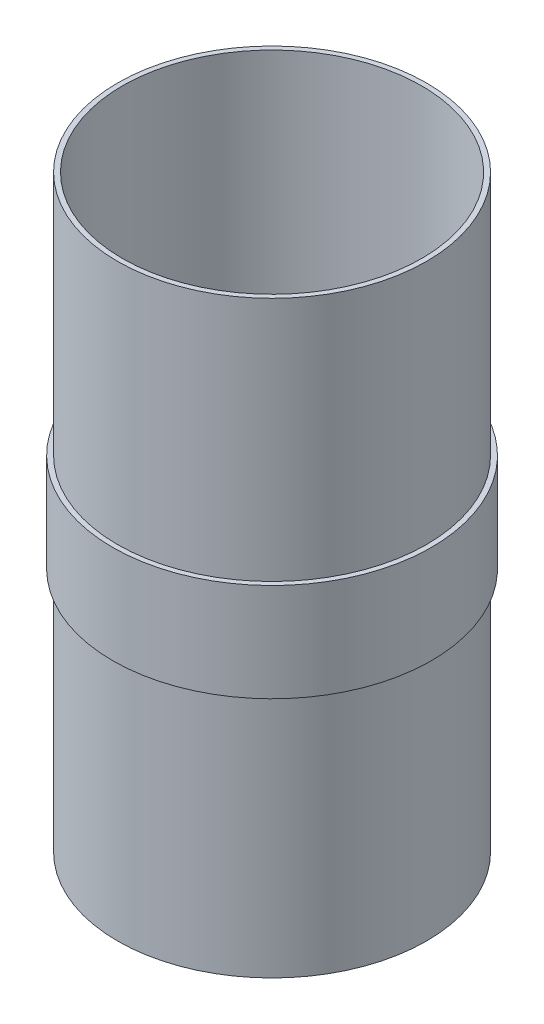
ISO-10303-21;
HEADER;
FILE_DESCRIPTION(('STEP AP214'),'2;1');
FILE_NAME('part.step','',(''),(''),'','','');
FILE_SCHEMA(('AUTOMOTIVE_DESIGN { 1 0 10303 214 1 1 1 1 }'));
ENDSEC;
DATA;
#1=APPLICATION_CONTEXT('core data for automotive mechanical design processes');
#2=APPLICATION_PROTOCOL_DEFINITION('international standard','automotive_design',2000,#1);
#3=PRODUCT_CONTEXT('',#1,'mechanical');
#4=PRODUCT('Part','Part','',(#3));
#5=PRODUCT_RELATED_PRODUCT_CATEGORY('part','',(#4));
#6=PRODUCT_DEFINITION_FORMATION('','',#4);
#7=PRODUCT_DEFINITION_CONTEXT('part definition',#1,'design');
#8=PRODUCT_DEFINITION('design','',#6,#7);
#9=PRODUCT_DEFINITION_SHAPE('','',#8);
#10=(LENGTH_UNIT() NAMED_UNIT(*) SI_UNIT(.MILLI.,.METRE.));
#11=(NAMED_UNIT(*) PLANE_ANGLE_UNIT() SI_UNIT($,.RADIAN.));
#12=(NAMED_UNIT(*) SI_UNIT($,.STERADIAN.) SOLID_ANGLE_UNIT());
#13=UNCERTAINTY_MEASURE_WITH_UNIT(LENGTH_MEASURE(1.E-05),#10,'distance_accuracy_value','');
#14=(GEOMETRIC_REPRESENTATION_CONTEXT(3) GLOBAL_UNCERTAINTY_ASSIGNED_CONTEXT((#13)) GLOBAL_UNIT_ASSIGNED_CONTEXT((#10,
#11,#12)) REPRESENTATION_CONTEXT('',''));
#15=CARTESIAN_POINT('',(0.,0.,0.));
#16=DIRECTION('',(0.,0.,1.));
#17=DIRECTION('',(1.,0.,0.));
#18=AXIS2_PLACEMENT_3D('',#15,#16,#17);
#19=CARTESIAN_POINT('',(0.,0.,0.));
#20=DIRECTION('',(0.,1.,0.));
#21=DIRECTION('',(0.,0.,1.));
#22=AXIS2_PLACEMENT_3D('',#19,#20,#21);
#23=PLANE('',#22);
#24=CARTESIAN_POINT('',(0.,0.,0.));
#25=DIRECTION('',(0.,1.,0.));
#26=DIRECTION('',(0.,0.,1.));
#27=AXIS2_PLACEMENT_3D('',#24,#25,#26);
#28=CIRCLE('',#27,31.5);
#29=CARTESIAN_POINT('',(0.,0.,31.5));
#30=VERTEX_POINT('',#29);
#31=EDGE_CURVE('E62',#30,#30,#28,.T.);
#32=ORIENTED_EDGE('',*,*,#31,.F.);
#33=EDGE_LOOP('',(#32));
#34=FACE_BOUND('',#33,.T.);
#35=CARTESIAN_POINT('',(0.,0.,0.));
#36=DIRECTION('',(0.,1.,0.));
#37=DIRECTION('',(0.,0.,1.));
#38=AXIS2_PLACEMENT_3D('',#35,#36,#37);
#39=CIRCLE('',#38,30.5);
#40=CARTESIAN_POINT('',(0.,0.,30.5));
#41=VERTEX_POINT('',#40);
#42=EDGE_CURVE('E71',#41,#41,#39,.T.);
#43=ORIENTED_EDGE('',*,*,#42,.T.);
#44=EDGE_LOOP('',(#43));
#45=FACE_BOUND('',#44,.T.);
#46=ADVANCED_FACE('F58',(#34,#45),#23,.F.);
#47=CARTESIAN_POINT('',(0.,50.,0.));
#48=DIRECTION('',(0.,-1.,0.));
#49=DIRECTION('',(0.,0.,-1.));
#50=AXIS2_PLACEMENT_3D('',#47,#48,#49);
#51=CYLINDRICAL_SURFACE('',#50,31.5);
#52=CARTESIAN_POINT('',(0.,50.,0.));
#53=DIRECTION('',(0.,1.,0.));
#54=DIRECTION('',(0.,0.,1.));
#55=AXIS2_PLACEMENT_3D('',#52,#53,#54);
#56=CIRCLE('',#55,31.5);
#57=CARTESIAN_POINT('',(0.,50.,31.5));
#58=VERTEX_POINT('',#57);
#59=EDGE_CURVE('E11',#58,#58,#56,.T.);
#60=ORIENTED_EDGE('',*,*,#59,.F.);
#61=EDGE_LOOP('',(#60));
#62=FACE_BOUND('',#61,.T.);
#63=ORIENTED_EDGE('',*,*,#31,.T.);
#64=EDGE_LOOP('',(#63));
#65=FACE_BOUND('',#64,.T.);
#66=ADVANCED_FACE('F60',(#62,#65),#51,.T.);
#67=CARTESIAN_POINT('',(0.,50.,0.));
#68=DIRECTION('',(0.,-1.,0.));
#69=DIRECTION('',(0.,0.,-1.));
#70=AXIS2_PLACEMENT_3D('',#67,#68,#69);
#71=CYLINDRICAL_SURFACE('',#70,30.5);
#72=ORIENTED_EDGE('',*,*,#42,.F.);
#73=EDGE_LOOP('',(#72));
#74=FACE_BOUND('',#73,.T.);
#75=CARTESIAN_POINT('',(0.,65.,0.));
#76=DIRECTION('',(0.,1.,0.));
#77=DIRECTION('',(0.,0.,1.));
#78=AXIS2_PLACEMENT_3D('',#75,#76,#77);
#79=CIRCLE('',#78,30.5);
#80=CARTESIAN_POINT('',(0.,65.,30.5));
#81=VERTEX_POINT('',#80);
#82=EDGE_CURVE('E85',#81,#81,#79,.T.);
#83=ORIENTED_EDGE('',*,*,#82,.T.);
#84=EDGE_LOOP('',(#83));
#85=FACE_BOUND('',#84,.T.);
#86=ADVANCED_FACE('F130',(#74,#85),#71,.F.);
#87=CARTESIAN_POINT('',(0.,70.,0.));
#88=DIRECTION('',(0.,1.,0.));
#89=DIRECTION('',(0.,0.,1.));
#90=AXIS2_PLACEMENT_3D('',#87,#88,#89);
#91=PLANE('',#90);
#92=CARTESIAN_POINT('',(0.,70.,0.));
#93=DIRECTION('',(0.,1.,0.));
#94=DIRECTION('',(0.,0.,1.));
#95=AXIS2_PLACEMENT_3D('',#92,#93,#94);
#96=CIRCLE('',#95,30.5);
#97=CARTESIAN_POINT('',(0.,70.,30.5));
#98=VERTEX_POINT('',#97);
#99=EDGE_CURVE('E76',#98,#98,#96,.F.);
#100=ORIENTED_EDGE('',*,*,#99,.F.);
#101=EDGE_LOOP('',(#100));
#102=FACE_BOUND('',#101,.T.);
#103=ADVANCED_FACE('F136',(#102),#91,.T.);
#104=CARTESIAN_POINT('',(0.,120.,0.));
#105=DIRECTION('',(0.,-1.,0.));
#106=DIRECTION('',(0.,0.,-1.));
#107=AXIS2_PLACEMENT_3D('',#104,#105,#106);
#108=CYLINDRICAL_SURFACE('',#107,30.5);
#109=CARTESIAN_POINT('',(0.,120.,0.));
#110=DIRECTION('',(0.,1.,0.));
#111=DIRECTION('',(0.,0.,1.));
#112=AXIS2_PLACEMENT_3D('',#109,#110,#111);
#113=CIRCLE('',#112,30.5);
#114=CARTESIAN_POINT('',(0.,120.,30.5));
#115=VERTEX_POINT('',#114);
#116=EDGE_CURVE('E97',#115,#115,#113,.T.);
#117=ORIENTED_EDGE('',*,*,#116,.T.);
#118=EDGE_LOOP('',(#117));
#119=FACE_BOUND('',#118,.T.);
#120=ORIENTED_EDGE('',*,*,#99,.T.);
#121=EDGE_LOOP('',(#120));
#122=FACE_BOUND('',#121,.T.);
#123=ADVANCED_FACE('F105',(#119,#122),#108,.F.);
#124=CARTESIAN_POINT('',(0.,120.,0.));
#125=DIRECTION('',(0.,-1.,0.));
#126=DIRECTION('',(0.,0.,-1.));
#127=AXIS2_PLACEMENT_3D('',#124,#125,#126);
#128=CYLINDRICAL_SURFACE('',#127,31.5);
#129=CARTESIAN_POINT('',(0.,120.,0.));
#130=DIRECTION('',(0.,1.,0.));
#131=DIRECTION('',(0.,0.,1.));
#132=AXIS2_PLACEMENT_3D('',#129,#130,#131);
#133=CIRCLE('',#132,31.5);
#134=CARTESIAN_POINT('',(0.,120.,31.5));
#135=VERTEX_POINT('',#134);
#136=EDGE_CURVE('E92',#135,#135,#133,.T.);
#137=ORIENTED_EDGE('',*,*,#136,.F.);
#138=EDGE_LOOP('',(#137));
#139=FACE_BOUND('',#138,.T.);
#140=CARTESIAN_POINT('',(0.,70.,0.));
#141=DIRECTION('',(0.,1.,0.));
#142=DIRECTION('',(0.,0.,1.));
#143=AXIS2_PLACEMENT_3D('',#140,#141,#142);
#144=CIRCLE('',#143,31.5);
#145=CARTESIAN_POINT('',(0.,70.,31.5));
#146=VERTEX_POINT('',#145);
#147=EDGE_CURVE('E93',#146,#146,#144,.T.);
#148=ORIENTED_EDGE('',*,*,#147,.T.);
#149=EDGE_LOOP('',(#148));
#150=FACE_BOUND('',#149,.T.);
#151=ADVANCED_FACE('F111',(#139,#150),#128,.T.);
#152=CARTESIAN_POINT('',(0.,120.,0.));
#153=DIRECTION('',(0.,1.,0.));
#154=DIRECTION('',(0.,0.,1.));
#155=AXIS2_PLACEMENT_3D('',#152,#153,#154);
#156=PLANE('',#155);
#157=ORIENTED_EDGE('',*,*,#136,.T.);
#158=EDGE_LOOP('',(#157));
#159=FACE_BOUND('',#158,.T.);
#160=ORIENTED_EDGE('',*,*,#116,.F.);
#161=EDGE_LOOP('',(#160));
#162=FACE_BOUND('',#161,.T.);
#163=ADVANCED_FACE('F108',(#159,#162),#156,.T.);
#164=CARTESIAN_POINT('',(0.,70.,0.));
#165=DIRECTION('',(0.,-1.,0.));
#166=DIRECTION('',(0.,0.,-1.));
#167=AXIS2_PLACEMENT_3D('',#164,#165,#166);
#168=CYLINDRICAL_SURFACE('',#167,32.5);
#169=CARTESIAN_POINT('',(0.,70.,0.));
#170=DIRECTION('',(0.,1.,0.));
#171=DIRECTION('',(0.,0.,1.));
#172=AXIS2_PLACEMENT_3D('',#169,#170,#171);
#173=CIRCLE('',#172,32.5);
#174=CARTESIAN_POINT('',(0.,70.,32.5));
#175=VERTEX_POINT('',#174);
#176=EDGE_CURVE('E80',#175,#175,#173,.T.);
#177=ORIENTED_EDGE('',*,*,#176,.F.);
#178=EDGE_LOOP('',(#177));
#179=FACE_BOUND('',#178,.T.);
#180=CARTESIAN_POINT('',(0.,50.,0.));
#181=DIRECTION('',(0.,1.,0.));
#182=DIRECTION('',(0.,0.,1.));
#183=AXIS2_PLACEMENT_3D('',#180,#181,#182);
#184=CIRCLE('',#183,32.5);
#185=CARTESIAN_POINT('',(0.,50.,32.5));
#186=VERTEX_POINT('',#185);
#187=EDGE_CURVE('E81',#186,#186,#184,.T.);
#188=ORIENTED_EDGE('',*,*,#187,.T.);
#189=EDGE_LOOP('',(#188));
#190=FACE_BOUND('',#189,.T.);
#191=ADVANCED_FACE('F110',(#179,#190),#168,.T.);
#192=CARTESIAN_POINT('',(0.,50.,0.));
#193=DIRECTION('',(0.,1.,0.));
#194=DIRECTION('',(0.,0.,1.));
#195=AXIS2_PLACEMENT_3D('',#192,#193,#194);
#196=PLANE('',#195);
#197=ORIENTED_EDGE('',*,*,#59,.T.);
#198=EDGE_LOOP('',(#197));
#199=FACE_BOUND('',#198,.T.);
#200=ORIENTED_EDGE('',*,*,#187,.F.);
#201=EDGE_LOOP('',(#200));
#202=FACE_BOUND('',#201,.T.);
#203=ADVANCED_FACE('F117',(#199,#202),#196,.F.);
#204=ORIENTED_EDGE('',*,*,#147,.F.);
#205=EDGE_LOOP('',(#204));
#206=FACE_BOUND('',#205,.T.);
#207=ORIENTED_EDGE('',*,*,#176,.T.);
#208=EDGE_LOOP('',(#207));
#209=FACE_BOUND('',#208,.T.);
#210=ADVANCED_FACE('F141',(#206,#209),#91,.T.);
#211=CARTESIAN_POINT('',(0.,65.,0.));
#212=DIRECTION('',(0.,1.,0.));
#213=DIRECTION('',(0.,0.,1.));
#214=AXIS2_PLACEMENT_3D('',#211,#212,#213);
#215=PLANE('',#214);
#216=ORIENTED_EDGE('',*,*,#82,.F.);
#217=EDGE_LOOP('',(#216));
#218=FACE_BOUND('',#217,.T.);
#219=ADVANCED_FACE('F144',(#218),#215,.F.);
#220=CLOSED_SHELL('',(#46,#66,#86,#103,#123,#151,#163,#191,#203,#210,#219));
#221=MANIFOLD_SOLID_BREP('B2',#220);
#222=ADVANCED_BREP_SHAPE_REPRESENTATION('',(#18,#221),#14);
#223=SHAPE_DEFINITION_REPRESENTATION(#9,#222);
ENDSEC;
END-ISO-10303-21;
